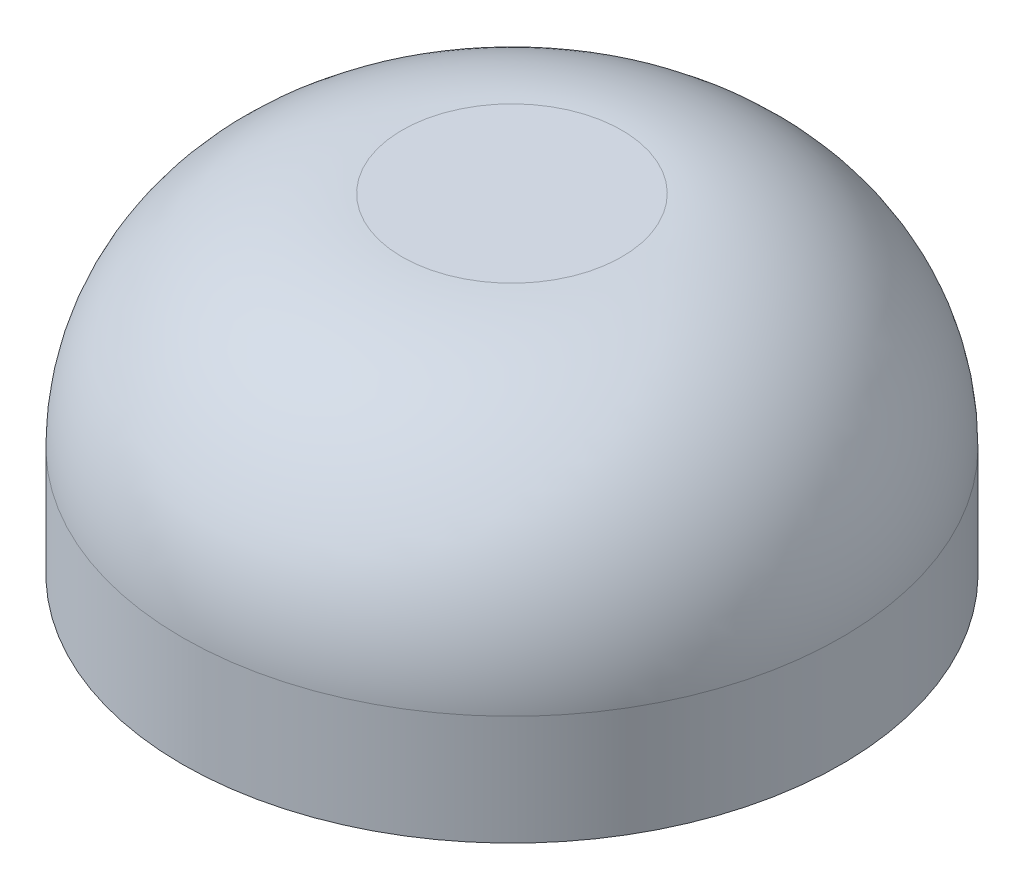
ISO-10303-21;
HEADER;
FILE_DESCRIPTION(('STEP AP214'),'2;1');
FILE_NAME('part.step','',(''),(''),'','','');
FILE_SCHEMA(('AUTOMOTIVE_DESIGN { 1 0 10303 214 1 1 1 1 }'));
ENDSEC;
DATA;
#1=APPLICATION_CONTEXT('core data for automotive mechanical design processes');
#2=APPLICATION_PROTOCOL_DEFINITION('international standard','automotive_design',2000,#1);
#3=PRODUCT_CONTEXT('',#1,'mechanical');
#4=PRODUCT('Part','Part','',(#3));
#5=PRODUCT_RELATED_PRODUCT_CATEGORY('part','',(#4));
#6=PRODUCT_DEFINITION_FORMATION('','',#4);
#7=PRODUCT_DEFINITION_CONTEXT('part definition',#1,'design');
#8=PRODUCT_DEFINITION('design','',#6,#7);
#9=PRODUCT_DEFINITION_SHAPE('','',#8);
#10=(LENGTH_UNIT() NAMED_UNIT(*) SI_UNIT(.MILLI.,.METRE.));
#11=(NAMED_UNIT(*) PLANE_ANGLE_UNIT() SI_UNIT($,.RADIAN.));
#12=(NAMED_UNIT(*) SI_UNIT($,.STERADIAN.) SOLID_ANGLE_UNIT());
#13=UNCERTAINTY_MEASURE_WITH_UNIT(LENGTH_MEASURE(1.E-05),#10,'distance_accuracy_value','');
#14=(GEOMETRIC_REPRESENTATION_CONTEXT(3) GLOBAL_UNCERTAINTY_ASSIGNED_CONTEXT((#13)) GLOBAL_UNIT_ASSIGNED_CONTEXT((#10,
#11,#12)) REPRESENTATION_CONTEXT('',''));
#15=CARTESIAN_POINT('',(0.,0.,0.));
#16=DIRECTION('',(0.,0.,1.));
#17=DIRECTION('',(1.,0.,0.));
#18=AXIS2_PLACEMENT_3D('',#15,#16,#17);
#19=CARTESIAN_POINT('',(0.,15.,0.));
#20=DIRECTION('',(0.,-1.,0.));
#21=DIRECTION('',(0.,0.,-1.));
#22=AXIS2_PLACEMENT_3D('',#19,#20,#21);
#23=CYLINDRICAL_SURFACE('',#22,15.);
#24=CARTESIAN_POINT('',(0.,5.,0.));
#25=DIRECTION('',(0.,1.,0.));
#26=DIRECTION('',(0.,0.,1.));
#27=AXIS2_PLACEMENT_3D('',#24,#25,#26);
#28=CIRCLE('',#27,15.);
#29=CARTESIAN_POINT('',(0.,5.,15.));
#30=VERTEX_POINT('',#29);
#31=EDGE_CURVE('E10',#30,#30,#28,.F.);
#32=ORIENTED_EDGE('',*,*,#31,.T.);
#33=EDGE_LOOP('',(#32));
#34=FACE_BOUND('',#33,.T.);
#35=CARTESIAN_POINT('',(0.,0.,0.));
#36=DIRECTION('',(0.,1.,0.));
#37=DIRECTION('',(0.,0.,1.));
#38=AXIS2_PLACEMENT_3D('',#35,#36,#37);
#39=CIRCLE('',#38,15.);
#40=CARTESIAN_POINT('',(0.,0.,15.));
#41=VERTEX_POINT('',#40);
#42=EDGE_CURVE('E42',#41,#41,#39,.T.);
#43=ORIENTED_EDGE('',*,*,#42,.T.);
#44=EDGE_LOOP('',(#43));
#45=FACE_BOUND('',#44,.T.);
#46=ADVANCED_FACE('F31',(#34,#45),#23,.T.);
#47=CARTESIAN_POINT('',(0.,15.,0.));
#48=DIRECTION('',(0.,1.,0.));
#49=DIRECTION('',(0.,0.,1.));
#50=AXIS2_PLACEMENT_3D('',#47,#48,#49);
#51=PLANE('',#50);
#52=CARTESIAN_POINT('',(0.,15.,0.));
#53=DIRECTION('',(0.,1.,0.));
#54=DIRECTION('',(0.,0.,1.));
#55=AXIS2_PLACEMENT_3D('',#52,#53,#54);
#56=CIRCLE('',#55,5.);
#57=CARTESIAN_POINT('',(0.,15.,5.));
#58=VERTEX_POINT('',#57);
#59=EDGE_CURVE('E38',#58,#58,#56,.T.);
#60=ORIENTED_EDGE('',*,*,#59,.T.);
#61=EDGE_LOOP('',(#60));
#62=FACE_BOUND('',#61,.T.);
#63=ADVANCED_FACE('F52',(#62),#51,.T.);
#64=CARTESIAN_POINT('',(0.,0.,0.));
#65=DIRECTION('',(0.,1.,0.));
#66=DIRECTION('',(0.,0.,1.));
#67=AXIS2_PLACEMENT_3D('',#64,#65,#66);
#68=PLANE('',#67);
#69=ORIENTED_EDGE('',*,*,#42,.F.);
#70=EDGE_LOOP('',(#69));
#71=FACE_BOUND('',#70,.T.);
#72=ADVANCED_FACE('F50',(#71),#68,.F.);
#73=CARTESIAN_POINT('',(0.,5.,0.));
#74=DIRECTION('',(0.,1.,0.));
#75=DIRECTION('',(0.,0.,1.));
#76=AXIS2_PLACEMENT_3D('',#73,#74,#75);
#77=DEGENERATE_TOROIDAL_SURFACE('',#76,5.,10.,.T.);
#78=ORIENTED_EDGE('',*,*,#31,.F.);
#79=EDGE_LOOP('',(#78));
#80=FACE_BOUND('',#79,.T.);
#81=ORIENTED_EDGE('',*,*,#59,.F.);
#82=EDGE_LOOP('',(#81));
#83=FACE_BOUND('',#82,.T.);
#84=ADVANCED_FACE('F33',(#80,#83),#77,.T.);
#85=CLOSED_SHELL('',(#46,#63,#72,#84));
#86=MANIFOLD_SOLID_BREP('B2',#85);
#87=ADVANCED_BREP_SHAPE_REPRESENTATION('',(#18,#86),#14);
#88=SHAPE_DEFINITION_REPRESENTATION(#9,#87);
ENDSEC;
END-ISO-10303-21;
